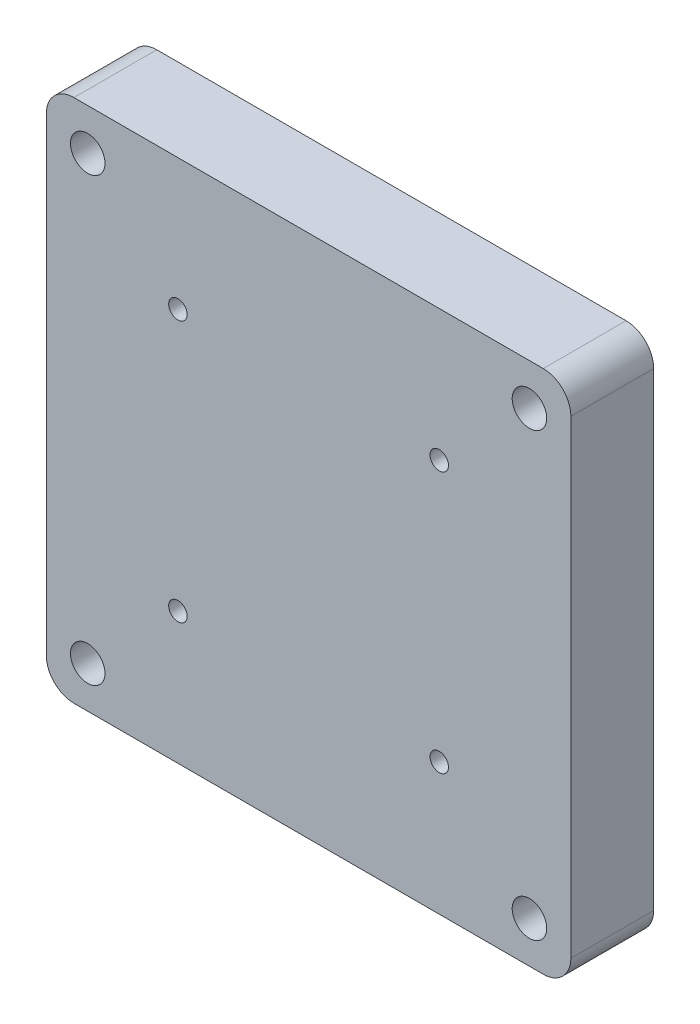
ISO-10303-21;
HEADER;
FILE_DESCRIPTION(('STEP AP214'),'2;1');
FILE_NAME('part.step','',(''),(''),'','','');
FILE_SCHEMA(('AUTOMOTIVE_DESIGN { 1 0 10303 214 1 1 1 1 }'));
ENDSEC;
DATA;
#1=APPLICATION_CONTEXT('core data for automotive mechanical design processes');
#2=APPLICATION_PROTOCOL_DEFINITION('international standard','automotive_design',2000,#1);
#3=PRODUCT_CONTEXT('',#1,'mechanical');
#4=PRODUCT('Part','Part','',(#3));
#5=PRODUCT_RELATED_PRODUCT_CATEGORY('part','',(#4));
#6=PRODUCT_DEFINITION_FORMATION('','',#4);
#7=PRODUCT_DEFINITION_CONTEXT('part definition',#1,'design');
#8=PRODUCT_DEFINITION('design','',#6,#7);
#9=PRODUCT_DEFINITION_SHAPE('','',#8);
#10=(LENGTH_UNIT() NAMED_UNIT(*) SI_UNIT(.MILLI.,.METRE.));
#11=(NAMED_UNIT(*) PLANE_ANGLE_UNIT() SI_UNIT($,.RADIAN.));
#12=(NAMED_UNIT(*) SI_UNIT($,.STERADIAN.) SOLID_ANGLE_UNIT());
#13=UNCERTAINTY_MEASURE_WITH_UNIT(LENGTH_MEASURE(1.E-05),#10,'distance_accuracy_value','');
#14=(GEOMETRIC_REPRESENTATION_CONTEXT(3) GLOBAL_UNCERTAINTY_ASSIGNED_CONTEXT((#13)) GLOBAL_UNIT_ASSIGNED_CONTEXT((#10,
#11,#12)) REPRESENTATION_CONTEXT('',''));
#15=CARTESIAN_POINT('',(0.,0.,0.));
#16=DIRECTION('',(0.,0.,1.));
#17=DIRECTION('',(1.,0.,0.));
#18=AXIS2_PLACEMENT_3D('',#15,#16,#17);
#19=CARTESIAN_POINT('',(0.,0.,0.));
#20=DIRECTION('',(0.,0.,1.));
#21=DIRECTION('',(1.,0.,0.));
#22=AXIS2_PLACEMENT_3D('',#19,#20,#21);
#23=PLANE('',#22);
#24=CARTESIAN_POINT('',(60.1040764008565,60.2081528017131,0.));
#25=DIRECTION('',(0.,0.,1.));
#26=DIRECTION('',(1.,0.,0.));
#27=AXIS2_PLACEMENT_3D('',#24,#25,#26);
#28=CIRCLE('',#27,4.25000000000001);
#29=CARTESIAN_POINT('',(64.3540764008565,60.2081528017131,0.));
#30=VERTEX_POINT('',#29);
#31=EDGE_CURVE('E205',#30,#30,#28,.T.);
#32=ORIENTED_EDGE('',*,*,#31,.T.);
#33=EDGE_LOOP('',(#32));
#34=FACE_BOUND('',#33,.T.);
#35=CARTESIAN_POINT('',(60.1040764008565,60.2081528017131,0.));
#36=DIRECTION('',(0.,0.,-1.));
#37=DIRECTION('',(-1.,0.,0.));
#38=AXIS2_PLACEMENT_3D('',#35,#36,#37);
#39=CIRCLE('',#38,10.99947);
#40=CARTESIAN_POINT('',(49.1046064008565,60.2081528017131,0.));
#41=VERTEX_POINT('',#40);
#42=EDGE_CURVE('E333',#41,#41,#39,.T.);
#43=ORIENTED_EDGE('',*,*,#42,.T.);
#44=EDGE_LOOP('',(#43));
#45=FACE_BOUND('',#44,.T.);
#46=ADVANCED_FACE('F45',(#34,#45),#23,.F.);
#47=CARTESIAN_POINT('',(-60.1040764008565,60.2081528017131,0.));
#48=DIRECTION('',(0.,0.,1.));
#49=DIRECTION('',(1.,0.,0.));
#50=AXIS2_PLACEMENT_3D('',#47,#48,#49);
#51=CIRCLE('',#50,4.25000000000001);
#52=CARTESIAN_POINT('',(-55.8540764008565,60.2081528017131,0.));
#53=VERTEX_POINT('',#52);
#54=EDGE_CURVE('E197',#53,#53,#51,.T.);
#55=ORIENTED_EDGE('',*,*,#54,.T.);
#56=EDGE_LOOP('',(#55));
#57=FACE_BOUND('',#56,.T.);
#58=CARTESIAN_POINT('',(-60.1040764008565,60.2081528017131,0.));
#59=DIRECTION('',(0.,0.,-1.));
#60=DIRECTION('',(-1.,0.,0.));
#61=AXIS2_PLACEMENT_3D('',#58,#59,#60);
#62=CIRCLE('',#61,10.99947);
#63=CARTESIAN_POINT('',(-71.1035464008565,60.2081528017131,0.));
#64=VERTEX_POINT('',#63);
#65=EDGE_CURVE('E325',#64,#64,#62,.T.);
#66=ORIENTED_EDGE('',*,*,#65,.T.);
#67=EDGE_LOOP('',(#66));
#68=FACE_BOUND('',#67,.T.);
#69=ADVANCED_FACE('F286',(#57,#68),#23,.F.);
#70=CARTESIAN_POINT('',(-60.1040764008565,-60.,0.));
#71=DIRECTION('',(0.,0.,1.));
#72=DIRECTION('',(1.,0.,0.));
#73=AXIS2_PLACEMENT_3D('',#70,#71,#72);
#74=CIRCLE('',#73,4.25000000000001);
#75=CARTESIAN_POINT('',(-55.8540764008565,-60.,0.));
#76=VERTEX_POINT('',#75);
#77=EDGE_CURVE('E184',#76,#76,#74,.T.);
#78=ORIENTED_EDGE('',*,*,#77,.T.);
#79=EDGE_LOOP('',(#78));
#80=FACE_BOUND('',#79,.T.);
#81=CARTESIAN_POINT('',(-60.1040764008565,-60.,0.));
#82=DIRECTION('',(0.,0.,-1.));
#83=DIRECTION('',(-1.,0.,0.));
#84=AXIS2_PLACEMENT_3D('',#81,#82,#83);
#85=CIRCLE('',#84,10.99947);
#86=CARTESIAN_POINT('',(-71.1035464008565,-60.,0.));
#87=VERTEX_POINT('',#86);
#88=EDGE_CURVE('E318',#87,#87,#85,.T.);
#89=ORIENTED_EDGE('',*,*,#88,.T.);
#90=EDGE_LOOP('',(#89));
#91=FACE_BOUND('',#90,.T.);
#92=ADVANCED_FACE('F294',(#80,#91),#23,.F.);
#93=CARTESIAN_POINT('',(60.1040764008566,-60.,0.));
#94=DIRECTION('',(0.,0.,1.));
#95=DIRECTION('',(1.,0.,0.));
#96=AXIS2_PLACEMENT_3D('',#93,#94,#95);
#97=CIRCLE('',#96,4.25000000000001);
#98=CARTESIAN_POINT('',(64.3540764008566,-60.,0.));
#99=VERTEX_POINT('',#98);
#100=EDGE_CURVE('E189',#99,#99,#97,.T.);
#101=ORIENTED_EDGE('',*,*,#100,.T.);
#102=EDGE_LOOP('',(#101));
#103=FACE_BOUND('',#102,.T.);
#104=CARTESIAN_POINT('',(60.1040764008566,-60.,0.));
#105=DIRECTION('',(0.,0.,-1.));
#106=DIRECTION('',(-1.,0.,0.));
#107=AXIS2_PLACEMENT_3D('',#104,#105,#106);
#108=CIRCLE('',#107,10.99947);
#109=CARTESIAN_POINT('',(49.1046064008566,-60.,0.));
#110=VERTEX_POINT('',#109);
#111=EDGE_CURVE('E311',#110,#110,#108,.T.);
#112=ORIENTED_EDGE('',*,*,#111,.T.);
#113=EDGE_LOOP('',(#112));
#114=FACE_BOUND('',#113,.T.);
#115=ADVANCED_FACE('F289',(#103,#114),#23,.F.);
#116=CARTESIAN_POINT('',(0.,0.,12.7));
#117=DIRECTION('',(0.,0.,1.));
#118=DIRECTION('',(1.,0.,0.));
#119=AXIS2_PLACEMENT_3D('',#116,#117,#118);
#120=PLANE('',#119);
#121=CARTESIAN_POINT('',(-101.6,101.6,12.7));
#122=DIRECTION('',(0.,0.,1.));
#123=DIRECTION('',(1.,0.,0.));
#124=AXIS2_PLACEMENT_3D('',#121,#122,#123);
#125=CIRCLE('',#124,7.93749999999997);
#126=CARTESIAN_POINT('',(-93.6625000000004,101.6,12.7));
#127=VERTEX_POINT('',#126);
#128=EDGE_CURVE('E168',#127,#127,#125,.T.);
#129=ORIENTED_EDGE('',*,*,#128,.F.);
#130=EDGE_LOOP('',(#129));
#131=FACE_BOUND('',#130,.T.);
#132=CARTESIAN_POINT('',(101.6,101.6,12.7));
#133=DIRECTION('',(0.,0.,1.));
#134=DIRECTION('',(1.,0.,0.));
#135=AXIS2_PLACEMENT_3D('',#132,#133,#134);
#136=CIRCLE('',#135,7.93749999999997);
#137=CARTESIAN_POINT('',(109.5375,101.6,12.7));
#138=VERTEX_POINT('',#137);
#139=EDGE_CURVE('E174',#138,#138,#136,.T.);
#140=ORIENTED_EDGE('',*,*,#139,.F.);
#141=EDGE_LOOP('',(#140));
#142=FACE_BOUND('',#141,.T.);
#143=CARTESIAN_POINT('',(101.6,-101.6,12.7));
#144=DIRECTION('',(0.,0.,1.));
#145=DIRECTION('',(1.,0.,0.));
#146=AXIS2_PLACEMENT_3D('',#143,#144,#145);
#147=CIRCLE('',#146,7.93749999999998);
#148=CARTESIAN_POINT('',(109.5375,-101.6,12.7));
#149=VERTEX_POINT('',#148);
#150=EDGE_CURVE('E169',#149,#149,#147,.T.);
#151=ORIENTED_EDGE('',*,*,#150,.F.);
#152=EDGE_LOOP('',(#151));
#153=FACE_BOUND('',#152,.T.);
#154=CARTESIAN_POINT('',(-101.6,-101.6,12.7));
#155=DIRECTION('',(0.,0.,1.));
#156=DIRECTION('',(1.,0.,0.));
#157=AXIS2_PLACEMENT_3D('',#154,#155,#156);
#158=CIRCLE('',#157,7.9375);
#159=CARTESIAN_POINT('',(-93.6624999999997,-101.6,12.7));
#160=VERTEX_POINT('',#159);
#161=EDGE_CURVE('E173',#160,#160,#158,.T.);
#162=ORIENTED_EDGE('',*,*,#161,.F.);
#163=EDGE_LOOP('',(#162));
#164=FACE_BOUND('',#163,.T.);
#165=CARTESIAN_POINT('',(60.1040764008566,-60.,12.7));
#166=DIRECTION('',(0.,0.,1.));
#167=DIRECTION('',(1.,0.,0.));
#168=AXIS2_PLACEMENT_3D('',#165,#166,#167);
#169=CIRCLE('',#168,4.25000000000001);
#170=CARTESIAN_POINT('',(64.3540764008566,-60.,12.7));
#171=VERTEX_POINT('',#170);
#172=EDGE_CURVE('E193',#171,#171,#169,.T.);
#173=ORIENTED_EDGE('',*,*,#172,.F.);
#174=EDGE_LOOP('',(#173));
#175=FACE_BOUND('',#174,.T.);
#176=CARTESIAN_POINT('',(60.1040764008565,60.2081528017131,12.7));
#177=DIRECTION('',(0.,0.,1.));
#178=DIRECTION('',(1.,0.,0.));
#179=AXIS2_PLACEMENT_3D('',#176,#177,#178);
#180=CIRCLE('',#179,4.25000000000001);
#181=CARTESIAN_POINT('',(64.3540764008565,60.2081528017131,12.7));
#182=VERTEX_POINT('',#181);
#183=EDGE_CURVE('E209',#182,#182,#180,.T.);
#184=ORIENTED_EDGE('',*,*,#183,.F.);
#185=EDGE_LOOP('',(#184));
#186=FACE_BOUND('',#185,.T.);
#187=DIRECTION('',(0.,-1.,0.));
#188=VECTOR('',#187,1.);
#189=CARTESIAN_POINT('',(-120.65,120.65,12.7));
#190=LINE('',#189,#188);
#191=CARTESIAN_POINT('',(-120.65,107.95,12.7));
#192=VERTEX_POINT('',#191);
#193=CARTESIAN_POINT('',(-120.65,-107.95,12.7));
#194=VERTEX_POINT('',#193);
#195=EDGE_CURVE('E213',#192,#194,#190,.T.);
#196=ORIENTED_EDGE('',*,*,#195,.T.);
#197=CARTESIAN_POINT('',(-107.95,-107.95,12.7));
#198=DIRECTION('',(0.,0.,1.));
#199=DIRECTION('',(1.,0.,0.));
#200=AXIS2_PLACEMENT_3D('',#197,#198,#199);
#201=CIRCLE('',#200,12.7);
#202=CARTESIAN_POINT('',(-107.95,-120.65,12.7));
#203=VERTEX_POINT('',#202);
#204=EDGE_CURVE('E243',#194,#203,#201,.T.);
#205=ORIENTED_EDGE('',*,*,#204,.T.);
#206=DIRECTION('',(1.,0.,0.));
#207=VECTOR('',#206,1.);
#208=CARTESIAN_POINT('',(-120.65,-120.65,12.7));
#209=LINE('',#208,#207);
#210=CARTESIAN_POINT('',(107.95,-120.65,12.7));
#211=VERTEX_POINT('',#210);
#212=EDGE_CURVE('E220',#203,#211,#209,.T.);
#213=ORIENTED_EDGE('',*,*,#212,.T.);
#214=CARTESIAN_POINT('',(107.95,-107.95,12.7));
#215=DIRECTION('',(0.,0.,1.));
#216=DIRECTION('',(1.,0.,0.));
#217=AXIS2_PLACEMENT_3D('',#214,#215,#216);
#218=CIRCLE('',#217,12.7);
#219=CARTESIAN_POINT('',(120.65,-107.95,12.7));
#220=VERTEX_POINT('',#219);
#221=EDGE_CURVE('E116',#211,#220,#218,.T.);
#222=ORIENTED_EDGE('',*,*,#221,.T.);
#223=DIRECTION('',(0.,1.,0.));
#224=VECTOR('',#223,1.);
#225=CARTESIAN_POINT('',(120.65,120.65,12.7));
#226=LINE('',#225,#224);
#227=CARTESIAN_POINT('',(120.65,107.95,12.7));
#228=VERTEX_POINT('',#227);
#229=EDGE_CURVE('E223',#220,#228,#226,.T.);
#230=ORIENTED_EDGE('',*,*,#229,.T.);
#231=CARTESIAN_POINT('',(107.95,107.95,12.7));
#232=DIRECTION('',(0.,0.,1.));
#233=DIRECTION('',(1.,0.,0.));
#234=AXIS2_PLACEMENT_3D('',#231,#232,#233);
#235=CIRCLE('',#234,12.7);
#236=CARTESIAN_POINT('',(107.95,120.65,12.7));
#237=VERTEX_POINT('',#236);
#238=EDGE_CURVE('E68',#228,#237,#235,.T.);
#239=ORIENTED_EDGE('',*,*,#238,.T.);
#240=DIRECTION('',(-1.,0.,0.));
#241=VECTOR('',#240,1.);
#242=CARTESIAN_POINT('',(-120.65,120.65,12.7));
#243=LINE('',#242,#241);
#244=CARTESIAN_POINT('',(-107.95,120.65,12.7));
#245=VERTEX_POINT('',#244);
#246=EDGE_CURVE('E122',#237,#245,#243,.T.);
#247=ORIENTED_EDGE('',*,*,#246,.T.);
#248=CARTESIAN_POINT('',(-107.95,107.95,12.7));
#249=DIRECTION('',(0.,0.,1.));
#250=DIRECTION('',(1.,0.,0.));
#251=AXIS2_PLACEMENT_3D('',#248,#249,#250);
#252=CIRCLE('',#251,12.7);
#253=EDGE_CURVE('E240',#245,#192,#252,.T.);
#254=ORIENTED_EDGE('',*,*,#253,.T.);
#255=EDGE_LOOP('',(#196,#205,#213,#222,#230,#239,#247,#254));
#256=FACE_BOUND('',#255,.T.);
#257=CARTESIAN_POINT('',(-60.1040764008565,60.2081528017131,12.7));
#258=DIRECTION('',(0.,0.,1.));
#259=DIRECTION('',(1.,0.,0.));
#260=AXIS2_PLACEMENT_3D('',#257,#258,#259);
#261=CIRCLE('',#260,4.25000000000001);
#262=CARTESIAN_POINT('',(-55.8540764008565,60.2081528017131,12.7));
#263=VERTEX_POINT('',#262);
#264=EDGE_CURVE('E201',#263,#263,#261,.T.);
#265=ORIENTED_EDGE('',*,*,#264,.F.);
#266=EDGE_LOOP('',(#265));
#267=FACE_BOUND('',#266,.T.);
#268=CARTESIAN_POINT('',(-60.1040764008565,-60.,12.7));
#269=DIRECTION('',(0.,0.,1.));
#270=DIRECTION('',(1.,0.,0.));
#271=AXIS2_PLACEMENT_3D('',#268,#269,#270);
#272=CIRCLE('',#271,4.25000000000001);
#273=CARTESIAN_POINT('',(-55.8540764008565,-60.,12.7));
#274=VERTEX_POINT('',#273);
#275=EDGE_CURVE('E185',#274,#274,#272,.T.);
#276=ORIENTED_EDGE('',*,*,#275,.F.);
#277=EDGE_LOOP('',(#276));
#278=FACE_BOUND('',#277,.T.);
#279=ADVANCED_FACE('F254',(#131,#142,#153,#164,#175,#186,#256,#267,#278),#120,.T.);
#280=CARTESIAN_POINT('',(-120.65,120.65,12.7));
#281=DIRECTION('',(1.,0.,0.));
#282=DIRECTION('',(0.,0.,-1.));
#283=AXIS2_PLACEMENT_3D('',#280,#281,#282);
#284=PLANE('',#283);
#285=DIRECTION('',(0.,0.,-1.));
#286=VECTOR('',#285,1.);
#287=CARTESIAN_POINT('',(-120.65,107.95,12.7));
#288=LINE('',#287,#286);
#289=CARTESIAN_POINT('',(-120.65,107.95,-25.4));
#290=VERTEX_POINT('',#289);
#291=EDGE_CURVE('E230',#192,#290,#288,.T.);
#292=ORIENTED_EDGE('',*,*,#291,.T.);
#293=DIRECTION('',(0.,1.,0.));
#294=VECTOR('',#293,1.);
#295=CARTESIAN_POINT('',(-120.65,-107.95,-25.4));
#296=LINE('',#295,#294);
#297=CARTESIAN_POINT('',(-120.65,-107.95,-25.4));
#298=VERTEX_POINT('',#297);
#299=EDGE_CURVE('E151',#298,#290,#296,.T.);
#300=ORIENTED_EDGE('',*,*,#299,.F.);
#301=DIRECTION('',(0.,0.,-1.));
#302=VECTOR('',#301,1.);
#303=CARTESIAN_POINT('',(-120.65,-107.95,12.7));
#304=LINE('',#303,#302);
#305=EDGE_CURVE('E233',#298,#194,#304,.F.);
#306=ORIENTED_EDGE('',*,*,#305,.T.);
#307=ORIENTED_EDGE('',*,*,#195,.F.);
#308=EDGE_LOOP('',(#292,#300,#306,#307));
#309=FACE_BOUND('',#308,.T.);
#310=ADVANCED_FACE('F270',(#309),#284,.F.);
#311=CARTESIAN_POINT('',(-120.65,-120.65,12.7));
#312=DIRECTION('',(0.,1.,0.));
#313=DIRECTION('',(-1.,0.,0.));
#314=AXIS2_PLACEMENT_3D('',#311,#312,#313);
#315=PLANE('',#314);
#316=ORIENTED_EDGE('',*,*,#212,.F.);
#317=DIRECTION('',(0.,0.,-1.));
#318=VECTOR('',#317,1.);
#319=CARTESIAN_POINT('',(-107.95,-120.65,12.7));
#320=LINE('',#319,#318);
#321=CARTESIAN_POINT('',(-107.95,-120.65,-25.4));
#322=VERTEX_POINT('',#321);
#323=EDGE_CURVE('E121',#203,#322,#320,.T.);
#324=ORIENTED_EDGE('',*,*,#323,.T.);
#325=DIRECTION('',(-1.,0.,0.));
#326=VECTOR('',#325,1.);
#327=CARTESIAN_POINT('',(107.95,-120.65,-25.4));
#328=LINE('',#327,#326);
#329=CARTESIAN_POINT('',(107.95,-120.65,-25.4));
#330=VERTEX_POINT('',#329);
#331=EDGE_CURVE('E125',#330,#322,#328,.T.);
#332=ORIENTED_EDGE('',*,*,#331,.F.);
#333=DIRECTION('',(0.,0.,-1.));
#334=VECTOR('',#333,1.);
#335=CARTESIAN_POINT('',(107.95,-120.65,12.7));
#336=LINE('',#335,#334);
#337=EDGE_CURVE('E111',#330,#211,#336,.F.);
#338=ORIENTED_EDGE('',*,*,#337,.T.);
#339=EDGE_LOOP('',(#316,#324,#332,#338));
#340=FACE_BOUND('',#339,.T.);
#341=ADVANCED_FACE('F126',(#340),#315,.F.);
#342=CARTESIAN_POINT('',(120.65,120.65,12.7));
#343=DIRECTION('',(-1.,0.,0.));
#344=DIRECTION('',(0.,0.,1.));
#345=AXIS2_PLACEMENT_3D('',#342,#343,#344);
#346=PLANE('',#345);
#347=DIRECTION('',(0.,0.,-1.));
#348=VECTOR('',#347,1.);
#349=CARTESIAN_POINT('',(120.65,-107.95,12.7));
#350=LINE('',#349,#348);
#351=CARTESIAN_POINT('',(120.65,-107.95,-25.4));
#352=VERTEX_POINT('',#351);
#353=EDGE_CURVE('E54',#220,#352,#350,.T.);
#354=ORIENTED_EDGE('',*,*,#353,.T.);
#355=DIRECTION('',(0.,-1.,0.));
#356=VECTOR('',#355,1.);
#357=CARTESIAN_POINT('',(120.65,107.95,-25.4));
#358=LINE('',#357,#356);
#359=CARTESIAN_POINT('',(120.65,107.95,-25.4));
#360=VERTEX_POINT('',#359);
#361=EDGE_CURVE('E139',#360,#352,#358,.T.);
#362=ORIENTED_EDGE('',*,*,#361,.F.);
#363=DIRECTION('',(0.,0.,-1.));
#364=VECTOR('',#363,1.);
#365=CARTESIAN_POINT('',(120.65,107.95,12.7));
#366=LINE('',#365,#364);
#367=EDGE_CURVE('E11',#360,#228,#366,.F.);
#368=ORIENTED_EDGE('',*,*,#367,.T.);
#369=ORIENTED_EDGE('',*,*,#229,.F.);
#370=EDGE_LOOP('',(#354,#362,#368,#369));
#371=FACE_BOUND('',#370,.T.);
#372=ADVANCED_FACE('F253',(#371),#346,.F.);
#373=CARTESIAN_POINT('',(-120.65,120.65,12.7));
#374=DIRECTION('',(0.,-1.,0.));
#375=DIRECTION('',(1.,0.,0.));
#376=AXIS2_PLACEMENT_3D('',#373,#374,#375);
#377=PLANE('',#376);
#378=DIRECTION('',(0.,0.,-1.));
#379=VECTOR('',#378,1.);
#380=CARTESIAN_POINT('',(107.95,120.65,12.7));
#381=LINE('',#380,#379);
#382=CARTESIAN_POINT('',(107.95,120.65,-25.4));
#383=VERTEX_POINT('',#382);
#384=EDGE_CURVE('E246',#237,#383,#381,.T.);
#385=ORIENTED_EDGE('',*,*,#384,.T.);
#386=DIRECTION('',(1.,0.,0.));
#387=VECTOR('',#386,1.);
#388=CARTESIAN_POINT('',(-107.95,120.65,-25.4));
#389=LINE('',#388,#387);
#390=CARTESIAN_POINT('',(-107.95,120.65,-25.4));
#391=VERTEX_POINT('',#390);
#392=EDGE_CURVE('E159',#391,#383,#389,.T.);
#393=ORIENTED_EDGE('',*,*,#392,.F.);
#394=DIRECTION('',(0.,0.,-1.));
#395=VECTOR('',#394,1.);
#396=CARTESIAN_POINT('',(-107.95,120.65,12.7));
#397=LINE('',#396,#395);
#398=EDGE_CURVE('E61',#391,#245,#397,.F.);
#399=ORIENTED_EDGE('',*,*,#398,.T.);
#400=ORIENTED_EDGE('',*,*,#246,.F.);
#401=EDGE_LOOP('',(#385,#393,#399,#400));
#402=FACE_BOUND('',#401,.T.);
#403=ADVANCED_FACE('F260',(#402),#377,.F.);
#404=CARTESIAN_POINT('',(60.1040764008565,60.2081528017131,12.7));
#405=DIRECTION('',(0.,0.,-1.));
#406=DIRECTION('',(-1.,0.,0.));
#407=AXIS2_PLACEMENT_3D('',#404,#405,#406);
#408=CYLINDRICAL_SURFACE('',#407,4.25000000000001);
#409=ORIENTED_EDGE('',*,*,#183,.T.);
#410=EDGE_LOOP('',(#409));
#411=FACE_BOUND('',#410,.T.);
#412=ORIENTED_EDGE('',*,*,#31,.F.);
#413=EDGE_LOOP('',(#412));
#414=FACE_BOUND('',#413,.T.);
#415=ADVANCED_FACE('F405',(#411,#414),#408,.F.);
#416=CARTESIAN_POINT('',(-60.1040764008565,60.2081528017131,12.7));
#417=DIRECTION('',(0.,0.,-1.));
#418=DIRECTION('',(-1.,0.,0.));
#419=AXIS2_PLACEMENT_3D('',#416,#417,#418);
#420=CYLINDRICAL_SURFACE('',#419,4.25000000000001);
#421=ORIENTED_EDGE('',*,*,#264,.T.);
#422=EDGE_LOOP('',(#421));
#423=FACE_BOUND('',#422,.T.);
#424=ORIENTED_EDGE('',*,*,#54,.F.);
#425=EDGE_LOOP('',(#424));
#426=FACE_BOUND('',#425,.T.);
#427=ADVANCED_FACE('F401',(#423,#426),#420,.F.);
#428=CARTESIAN_POINT('',(60.1040764008566,-60.,12.7));
#429=DIRECTION('',(0.,0.,-1.));
#430=DIRECTION('',(-1.,0.,0.));
#431=AXIS2_PLACEMENT_3D('',#428,#429,#430);
#432=CYLINDRICAL_SURFACE('',#431,4.25000000000001);
#433=ORIENTED_EDGE('',*,*,#172,.T.);
#434=EDGE_LOOP('',(#433));
#435=FACE_BOUND('',#434,.T.);
#436=ORIENTED_EDGE('',*,*,#100,.F.);
#437=EDGE_LOOP('',(#436));
#438=FACE_BOUND('',#437,.T.);
#439=ADVANCED_FACE('F397',(#435,#438),#432,.F.);
#440=CARTESIAN_POINT('',(-60.1040764008565,-60.,12.7));
#441=DIRECTION('',(0.,0.,-1.));
#442=DIRECTION('',(-1.,0.,0.));
#443=AXIS2_PLACEMENT_3D('',#440,#441,#442);
#444=CYLINDRICAL_SURFACE('',#443,4.25000000000001);
#445=ORIENTED_EDGE('',*,*,#275,.T.);
#446=EDGE_LOOP('',(#445));
#447=FACE_BOUND('',#446,.T.);
#448=ORIENTED_EDGE('',*,*,#77,.F.);
#449=EDGE_LOOP('',(#448));
#450=FACE_BOUND('',#449,.T.);
#451=ADVANCED_FACE('F393',(#447,#450),#444,.F.);
#452=CARTESIAN_POINT('',(-101.6,-101.6,0.));
#453=DIRECTION('',(0.,0.,1.));
#454=DIRECTION('',(1.,0.,0.));
#455=AXIS2_PLACEMENT_3D('',#452,#453,#454);
#456=CYLINDRICAL_SURFACE('',#455,7.9375);
#457=ORIENTED_EDGE('',*,*,#161,.T.);
#458=EDGE_LOOP('',(#457));
#459=FACE_BOUND('',#458,.T.);
#460=CARTESIAN_POINT('',(-101.6,-101.6,-25.4));
#461=DIRECTION('',(0.,0.,-1.));
#462=DIRECTION('',(-1.,0.,0.));
#463=AXIS2_PLACEMENT_3D('',#460,#461,#462);
#464=CIRCLE('',#463,7.9375);
#465=CARTESIAN_POINT('',(-109.5375,-101.6,-25.4));
#466=VERTEX_POINT('',#465);
#467=EDGE_CURVE('E145',#466,#466,#464,.T.);
#468=ORIENTED_EDGE('',*,*,#467,.T.);
#469=EDGE_LOOP('',(#468));
#470=FACE_BOUND('',#469,.T.);
#471=ADVANCED_FACE('F355',(#459,#470),#456,.F.);
#472=CARTESIAN_POINT('',(101.6,-101.6,0.));
#473=DIRECTION('',(0.,0.,1.));
#474=DIRECTION('',(1.,0.,0.));
#475=AXIS2_PLACEMENT_3D('',#472,#473,#474);
#476=CYLINDRICAL_SURFACE('',#475,7.93749999999998);
#477=ORIENTED_EDGE('',*,*,#150,.T.);
#478=EDGE_LOOP('',(#477));
#479=FACE_BOUND('',#478,.T.);
#480=CARTESIAN_POINT('',(101.6,-101.6,-25.4));
#481=DIRECTION('',(0.,0.,-1.));
#482=DIRECTION('',(-1.,0.,0.));
#483=AXIS2_PLACEMENT_3D('',#480,#481,#482);
#484=CIRCLE('',#483,7.93749999999997);
#485=CARTESIAN_POINT('',(93.6625000000004,-101.6,-25.4));
#486=VERTEX_POINT('',#485);
#487=EDGE_CURVE('E348',#486,#486,#484,.T.);
#488=ORIENTED_EDGE('',*,*,#487,.T.);
#489=EDGE_LOOP('',(#488));
#490=FACE_BOUND('',#489,.T.);
#491=ADVANCED_FACE('F384',(#479,#490),#476,.F.);
#492=CARTESIAN_POINT('',(101.6,101.6,0.));
#493=DIRECTION('',(0.,0.,1.));
#494=DIRECTION('',(1.,0.,0.));
#495=AXIS2_PLACEMENT_3D('',#492,#493,#494);
#496=CYLINDRICAL_SURFACE('',#495,7.93749999999997);
#497=ORIENTED_EDGE('',*,*,#139,.T.);
#498=EDGE_LOOP('',(#497));
#499=FACE_BOUND('',#498,.T.);
#500=CARTESIAN_POINT('',(101.6,101.6,-25.4));
#501=DIRECTION('',(0.,0.,-1.));
#502=DIRECTION('',(-1.,0.,0.));
#503=AXIS2_PLACEMENT_3D('',#500,#501,#502);
#504=CIRCLE('',#503,7.93749999999997);
#505=CARTESIAN_POINT('',(93.6624999999997,101.6,-25.4));
#506=VERTEX_POINT('',#505);
#507=EDGE_CURVE('E341',#506,#506,#504,.T.);
#508=ORIENTED_EDGE('',*,*,#507,.T.);
#509=EDGE_LOOP('',(#508));
#510=FACE_BOUND('',#509,.T.);
#511=ADVANCED_FACE('F281',(#499,#510),#496,.F.);
#512=CARTESIAN_POINT('',(-101.6,101.6,0.));
#513=DIRECTION('',(0.,0.,1.));
#514=DIRECTION('',(1.,0.,0.));
#515=AXIS2_PLACEMENT_3D('',#512,#513,#514);
#516=CYLINDRICAL_SURFACE('',#515,7.93749999999997);
#517=ORIENTED_EDGE('',*,*,#128,.T.);
#518=EDGE_LOOP('',(#517));
#519=FACE_BOUND('',#518,.T.);
#520=CARTESIAN_POINT('',(-101.6,101.6,-25.4));
#521=DIRECTION('',(0.,0.,-1.));
#522=DIRECTION('',(-1.,0.,0.));
#523=AXIS2_PLACEMENT_3D('',#520,#521,#522);
#524=CIRCLE('',#523,7.93749999999997);
#525=CARTESIAN_POINT('',(-109.5375,101.6,-25.4));
#526=VERTEX_POINT('',#525);
#527=EDGE_CURVE('E141',#526,#526,#524,.T.);
#528=ORIENTED_EDGE('',*,*,#527,.T.);
#529=EDGE_LOOP('',(#528));
#530=FACE_BOUND('',#529,.T.);
#531=ADVANCED_FACE('F274',(#519,#530),#516,.F.);
#532=CARTESIAN_POINT('',(-107.95,-107.95,12.7));
#533=DIRECTION('',(0.,0.,-1.));
#534=DIRECTION('',(-1.,0.,0.));
#535=AXIS2_PLACEMENT_3D('',#532,#533,#534);
#536=CYLINDRICAL_SURFACE('',#535,12.7);
#537=ORIENTED_EDGE('',*,*,#204,.F.);
#538=ORIENTED_EDGE('',*,*,#305,.F.);
#539=CARTESIAN_POINT('',(-107.95,-107.95,-25.4));
#540=DIRECTION('',(0.,0.,-1.));
#541=DIRECTION('',(-1.,0.,0.));
#542=AXIS2_PLACEMENT_3D('',#539,#540,#541);
#543=CIRCLE('',#542,12.7);
#544=EDGE_CURVE('E132',#322,#298,#543,.T.);
#545=ORIENTED_EDGE('',*,*,#544,.F.);
#546=ORIENTED_EDGE('',*,*,#323,.F.);
#547=EDGE_LOOP('',(#537,#538,#545,#546));
#548=FACE_BOUND('',#547,.T.);
#549=ADVANCED_FACE('F272',(#548),#536,.T.);
#550=CARTESIAN_POINT('',(-107.95,107.95,12.7));
#551=DIRECTION('',(0.,0.,-1.));
#552=DIRECTION('',(-1.,0.,0.));
#553=AXIS2_PLACEMENT_3D('',#550,#551,#552);
#554=CYLINDRICAL_SURFACE('',#553,12.7);
#555=ORIENTED_EDGE('',*,*,#253,.F.);
#556=ORIENTED_EDGE('',*,*,#398,.F.);
#557=CARTESIAN_POINT('',(-107.95,107.95,-25.4));
#558=DIRECTION('',(0.,0.,-1.));
#559=DIRECTION('',(-1.,0.,0.));
#560=AXIS2_PLACEMENT_3D('',#557,#558,#559);
#561=CIRCLE('',#560,12.7);
#562=EDGE_CURVE('E155',#290,#391,#561,.T.);
#563=ORIENTED_EDGE('',*,*,#562,.F.);
#564=ORIENTED_EDGE('',*,*,#291,.F.);
#565=EDGE_LOOP('',(#555,#556,#563,#564));
#566=FACE_BOUND('',#565,.T.);
#567=ADVANCED_FACE('F266',(#566),#554,.T.);
#568=CARTESIAN_POINT('',(107.95,107.95,12.7));
#569=DIRECTION('',(0.,0.,-1.));
#570=DIRECTION('',(-1.,0.,0.));
#571=AXIS2_PLACEMENT_3D('',#568,#569,#570);
#572=CYLINDRICAL_SURFACE('',#571,12.7);
#573=ORIENTED_EDGE('',*,*,#238,.F.);
#574=ORIENTED_EDGE('',*,*,#367,.F.);
#575=CARTESIAN_POINT('',(107.95,107.95,-25.4));
#576=DIRECTION('',(0.,0.,-1.));
#577=DIRECTION('',(-1.,0.,0.));
#578=AXIS2_PLACEMENT_3D('',#575,#576,#577);
#579=CIRCLE('',#578,12.7);
#580=EDGE_CURVE('E163',#383,#360,#579,.T.);
#581=ORIENTED_EDGE('',*,*,#580,.F.);
#582=ORIENTED_EDGE('',*,*,#384,.F.);
#583=EDGE_LOOP('',(#573,#574,#581,#582));
#584=FACE_BOUND('',#583,.T.);
#585=ADVANCED_FACE('F258',(#584),#572,.T.);
#586=CARTESIAN_POINT('',(107.95,-107.95,12.7));
#587=DIRECTION('',(0.,0.,-1.));
#588=DIRECTION('',(-1.,0.,0.));
#589=AXIS2_PLACEMENT_3D('',#586,#587,#588);
#590=CYLINDRICAL_SURFACE('',#589,12.7);
#591=ORIENTED_EDGE('',*,*,#221,.F.);
#592=ORIENTED_EDGE('',*,*,#337,.F.);
#593=CARTESIAN_POINT('',(107.95,-107.95,-25.4));
#594=DIRECTION('',(0.,0.,-1.));
#595=DIRECTION('',(-1.,0.,0.));
#596=AXIS2_PLACEMENT_3D('',#593,#594,#595);
#597=CIRCLE('',#596,12.7);
#598=EDGE_CURVE('E115',#352,#330,#597,.T.);
#599=ORIENTED_EDGE('',*,*,#598,.F.);
#600=ORIENTED_EDGE('',*,*,#353,.F.);
#601=EDGE_LOOP('',(#591,#592,#599,#600));
#602=FACE_BOUND('',#601,.T.);
#603=ADVANCED_FACE('F47',(#602),#590,.T.);
#604=CARTESIAN_POINT('',(107.95,-107.95,-25.4));
#605=DIRECTION('',(0.,0.,-1.));
#606=DIRECTION('',(-1.,0.,0.));
#607=AXIS2_PLACEMENT_3D('',#604,#605,#606);
#608=PLANE('',#607);
#609=CARTESIAN_POINT('',(-60.1040764008565,-60.,-25.4));
#610=DIRECTION('',(0.,0.,-1.));
#611=DIRECTION('',(-1.,0.,0.));
#612=AXIS2_PLACEMENT_3D('',#609,#610,#611);
#613=CIRCLE('',#612,10.99947);
#614=CARTESIAN_POINT('',(-71.1035464008565,-60.,-25.4));
#615=VERTEX_POINT('',#614);
#616=EDGE_CURVE('E321',#615,#615,#613,.T.);
#617=ORIENTED_EDGE('',*,*,#616,.F.);
#618=EDGE_LOOP('',(#617));
#619=FACE_BOUND('',#618,.T.);
#620=CARTESIAN_POINT('',(60.1040764008565,60.2081528017131,-25.4));
#621=DIRECTION('',(0.,0.,-1.));
#622=DIRECTION('',(-1.,0.,0.));
#623=AXIS2_PLACEMENT_3D('',#620,#621,#622);
#624=CIRCLE('',#623,10.99947);
#625=CARTESIAN_POINT('',(49.1046064008565,60.2081528017131,-25.4));
#626=VERTEX_POINT('',#625);
#627=EDGE_CURVE('E337',#626,#626,#624,.T.);
#628=ORIENTED_EDGE('',*,*,#627,.F.);
#629=EDGE_LOOP('',(#628));
#630=FACE_BOUND('',#629,.T.);
#631=ORIENTED_EDGE('',*,*,#487,.F.);
#632=EDGE_LOOP('',(#631));
#633=FACE_BOUND('',#632,.T.);
#634=ORIENTED_EDGE('',*,*,#527,.F.);
#635=EDGE_LOOP('',(#634));
#636=FACE_BOUND('',#635,.T.);
#637=ORIENTED_EDGE('',*,*,#598,.T.);
#638=ORIENTED_EDGE('',*,*,#331,.T.);
#639=ORIENTED_EDGE('',*,*,#544,.T.);
#640=ORIENTED_EDGE('',*,*,#299,.T.);
#641=ORIENTED_EDGE('',*,*,#562,.T.);
#642=ORIENTED_EDGE('',*,*,#392,.T.);
#643=ORIENTED_EDGE('',*,*,#580,.T.);
#644=ORIENTED_EDGE('',*,*,#361,.T.);
#645=EDGE_LOOP('',(#637,#638,#639,#640,#641,#642,#643,#644));
#646=FACE_BOUND('',#645,.T.);
#647=ORIENTED_EDGE('',*,*,#467,.F.);
#648=EDGE_LOOP('',(#647));
#649=FACE_BOUND('',#648,.T.);
#650=ORIENTED_EDGE('',*,*,#507,.F.);
#651=EDGE_LOOP('',(#650));
#652=FACE_BOUND('',#651,.T.);
#653=CARTESIAN_POINT('',(-60.1040764008565,60.2081528017131,-25.4));
#654=DIRECTION('',(0.,0.,-1.));
#655=DIRECTION('',(-1.,0.,0.));
#656=AXIS2_PLACEMENT_3D('',#653,#654,#655);
#657=CIRCLE('',#656,10.99947);
#658=CARTESIAN_POINT('',(-71.1035464008565,60.2081528017131,-25.4));
#659=VERTEX_POINT('',#658);
#660=EDGE_CURVE('E329',#659,#659,#657,.T.);
#661=ORIENTED_EDGE('',*,*,#660,.F.);
#662=EDGE_LOOP('',(#661));
#663=FACE_BOUND('',#662,.T.);
#664=CARTESIAN_POINT('',(60.1040764008566,-60.,-25.4));
#665=DIRECTION('',(0.,0.,-1.));
#666=DIRECTION('',(-1.,0.,0.));
#667=AXIS2_PLACEMENT_3D('',#664,#665,#666);
#668=CIRCLE('',#667,10.99947);
#669=CARTESIAN_POINT('',(49.1046064008566,-60.,-25.4));
#670=VERTEX_POINT('',#669);
#671=EDGE_CURVE('E314',#670,#670,#668,.T.);
#672=ORIENTED_EDGE('',*,*,#671,.F.);
#673=EDGE_LOOP('',(#672));
#674=FACE_BOUND('',#673,.T.);
#675=ADVANCED_FACE('F135',(#619,#630,#633,#636,#646,#649,#652,#663,#674),#608,.T.);
#676=CARTESIAN_POINT('',(60.1040764008565,60.2081528017131,-25.4));
#677=DIRECTION('',(0.,0.,1.));
#678=DIRECTION('',(1.,0.,0.));
#679=AXIS2_PLACEMENT_3D('',#676,#677,#678);
#680=CYLINDRICAL_SURFACE('',#679,10.99947);
#681=ORIENTED_EDGE('',*,*,#627,.T.);
#682=EDGE_LOOP('',(#681));
#683=FACE_BOUND('',#682,.T.);
#684=ORIENTED_EDGE('',*,*,#42,.F.);
#685=EDGE_LOOP('',(#684));
#686=FACE_BOUND('',#685,.T.);
#687=ADVANCED_FACE('F358',(#683,#686),#680,.F.);
#688=CARTESIAN_POINT('',(-60.1040764008565,60.2081528017131,-25.4));
#689=DIRECTION('',(0.,0.,1.));
#690=DIRECTION('',(1.,0.,0.));
#691=AXIS2_PLACEMENT_3D('',#688,#689,#690);
#692=CYLINDRICAL_SURFACE('',#691,10.99947);
#693=ORIENTED_EDGE('',*,*,#660,.T.);
#694=EDGE_LOOP('',(#693));
#695=FACE_BOUND('',#694,.T.);
#696=ORIENTED_EDGE('',*,*,#65,.F.);
#697=EDGE_LOOP('',(#696));
#698=FACE_BOUND('',#697,.T.);
#699=ADVANCED_FACE('F374',(#695,#698),#692,.F.);
#700=CARTESIAN_POINT('',(-60.1040764008565,-60.,-25.4));
#701=DIRECTION('',(0.,0.,1.));
#702=DIRECTION('',(1.,0.,0.));
#703=AXIS2_PLACEMENT_3D('',#700,#701,#702);
#704=CYLINDRICAL_SURFACE('',#703,10.99947);
#705=ORIENTED_EDGE('',*,*,#616,.T.);
#706=EDGE_LOOP('',(#705));
#707=FACE_BOUND('',#706,.T.);
#708=ORIENTED_EDGE('',*,*,#88,.F.);
#709=EDGE_LOOP('',(#708));
#710=FACE_BOUND('',#709,.T.);
#711=ADVANCED_FACE('F369',(#707,#710),#704,.F.);
#712=CARTESIAN_POINT('',(60.1040764008566,-60.,-25.4));
#713=DIRECTION('',(0.,0.,1.));
#714=DIRECTION('',(1.,0.,0.));
#715=AXIS2_PLACEMENT_3D('',#712,#713,#714);
#716=CYLINDRICAL_SURFACE('',#715,10.99947);
#717=ORIENTED_EDGE('',*,*,#671,.T.);
#718=EDGE_LOOP('',(#717));
#719=FACE_BOUND('',#718,.T.);
#720=ORIENTED_EDGE('',*,*,#111,.F.);
#721=EDGE_LOOP('',(#720));
#722=FACE_BOUND('',#721,.T.);
#723=ADVANCED_FACE('F367',(#719,#722),#716,.F.);
#724=CLOSED_SHELL('',(#46,#69,#92,#115,#279,#310,#341,#372,#403,#415,#427,#439,#451,#471,#491,
#511,#531,#549,#567,#585,#603,#675,#687,#699,#711,#723));
#725=MANIFOLD_SOLID_BREP('B2',#724);
#726=ADVANCED_BREP_SHAPE_REPRESENTATION('',(#18,#725),#14);
#727=SHAPE_DEFINITION_REPRESENTATION(#9,#726);
ENDSEC;
END-ISO-10303-21;
